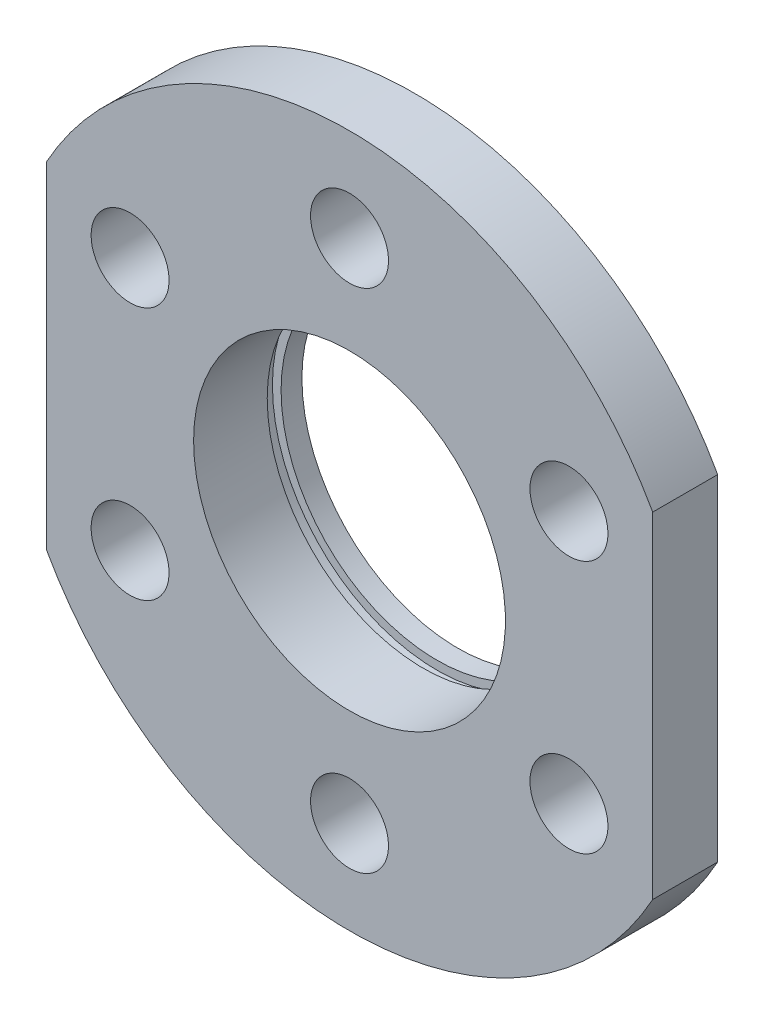
ISO-10303-21;
HEADER;
FILE_DESCRIPTION(('STEP AP214'),'2;1');
FILE_NAME('part.step','',(''),(''),'','','');
FILE_SCHEMA(('AUTOMOTIVE_DESIGN { 1 0 10303 214 1 1 1 1 }'));
ENDSEC;
DATA;
#1=APPLICATION_CONTEXT('core data for automotive mechanical design processes');
#2=APPLICATION_PROTOCOL_DEFINITION('international standard','automotive_design',2000,#1);
#3=PRODUCT_CONTEXT('',#1,'mechanical');
#4=PRODUCT('Part','Part','',(#3));
#5=PRODUCT_RELATED_PRODUCT_CATEGORY('part','',(#4));
#6=PRODUCT_DEFINITION_FORMATION('','',#4);
#7=PRODUCT_DEFINITION_CONTEXT('part definition',#1,'design');
#8=PRODUCT_DEFINITION('design','',#6,#7);
#9=PRODUCT_DEFINITION_SHAPE('','',#8);
#10=(LENGTH_UNIT() NAMED_UNIT(*) SI_UNIT(.MILLI.,.METRE.));
#11=(NAMED_UNIT(*) PLANE_ANGLE_UNIT() SI_UNIT($,.RADIAN.));
#12=(NAMED_UNIT(*) SI_UNIT($,.STERADIAN.) SOLID_ANGLE_UNIT());
#13=UNCERTAINTY_MEASURE_WITH_UNIT(LENGTH_MEASURE(1.E-05),#10,'distance_accuracy_value','');
#14=(GEOMETRIC_REPRESENTATION_CONTEXT(3) GLOBAL_UNCERTAINTY_ASSIGNED_CONTEXT((#13)) GLOBAL_UNIT_ASSIGNED_CONTEXT((#10,
#11,#12)) REPRESENTATION_CONTEXT('',''));
#15=CARTESIAN_POINT('',(0.,0.,0.));
#16=DIRECTION('',(0.,0.,1.));
#17=DIRECTION('',(1.,0.,0.));
#18=AXIS2_PLACEMENT_3D('',#15,#16,#17);
#19=CARTESIAN_POINT('',(0.,-1.02140518265514E-11,-13.6275138477817));
#20=DIRECTION('',(0.,0.,-1.));
#21=DIRECTION('',(-1.00000000000004,0.,0.));
#22=AXIS2_PLACEMENT_3D('',#19,#20,#21);
#23=CYLINDRICAL_SURFACE('',#22,40.);
#24=DIRECTION('',(0.,0.,-1.));
#25=VECTOR('',#24,1.);
#26=CARTESIAN_POINT('',(34.9999999999999,19.364916731027,-13.6275138478035));
#27=LINE('',#26,#25);
#28=CARTESIAN_POINT('',(35.,19.3649167310268,-7.5000000000216));
#29=VERTEX_POINT('',#28);
#30=CARTESIAN_POINT('',(35.,19.3649167310268,-2.17603712826531E-11));
#31=VERTEX_POINT('',#30);
#32=EDGE_CURVE('E12',#29,#31,#27,.F.);
#33=ORIENTED_EDGE('',*,*,#32,.F.);
#34=CARTESIAN_POINT('',(0.,-1.02140518265514E-11,-7.50000000000028));
#35=DIRECTION('',(0.,0.,-1.));
#36=DIRECTION('',(-1.00000000000004,0.,0.));
#37=AXIS2_PLACEMENT_3D('',#34,#35,#36);
#38=CIRCLE('',#37,40.);
#39=CARTESIAN_POINT('',(-35.0000000000051,19.364916731027,-7.50000000000028));
#40=VERTEX_POINT('',#39);
#41=EDGE_CURVE('E163',#40,#29,#38,.T.);
#42=ORIENTED_EDGE('',*,*,#41,.F.);
#43=DIRECTION('',(0.,0.,-1.));
#44=VECTOR('',#43,1.);
#45=CARTESIAN_POINT('',(-35.0000000000051,19.364916731027,-13.6275138477822));
#46=LINE('',#45,#44);
#47=CARTESIAN_POINT('',(-35.0000000000051,19.364916731027,0.));
#48=VERTEX_POINT('',#47);
#49=EDGE_CURVE('E160',#48,#40,#46,.T.);
#50=ORIENTED_EDGE('',*,*,#49,.F.);
#51=CARTESIAN_POINT('',(0.,-1.02140518265514E-11,0.));
#52=DIRECTION('',(0.,0.,-1.));
#53=DIRECTION('',(-1.00000000000004,0.,0.));
#54=AXIS2_PLACEMENT_3D('',#51,#52,#53);
#55=CIRCLE('',#54,40.);
#56=EDGE_CURVE('E157',#48,#31,#55,.T.);
#57=ORIENTED_EDGE('',*,*,#56,.T.);
#58=EDGE_LOOP('',(#33,#42,#50,#57));
#59=FACE_BOUND('',#58,.T.);
#60=ADVANCED_FACE('F106',(#59),#23,.T.);
#61=CARTESIAN_POINT('',(1.0547118733939E-11,39.9999999999898,0.));
#62=DIRECTION('',(0.,0.,1.));
#63=DIRECTION('',(1.00000000000004,0.,0.));
#64=AXIS2_PLACEMENT_3D('',#61,#62,#63);
#65=PLANE('',#64);
#66=DIRECTION('',(0.,-1.00000000000004,0.));
#67=VECTOR('',#66,1.);
#68=CARTESIAN_POINT('',(35.,19.3649167310268,-2.17603712826531E-11));
#69=LINE('',#68,#67);
#70=CARTESIAN_POINT('',(35.,-19.3649167310475,-2.17603712826531E-11));
#71=VERTEX_POINT('',#70);
#72=EDGE_CURVE('E120',#31,#71,#69,.T.);
#73=ORIENTED_EDGE('',*,*,#72,.F.);
#74=ORIENTED_EDGE('',*,*,#56,.F.);
#75=DIRECTION('',(0.,1.00000000000004,0.));
#76=VECTOR('',#75,1.);
#77=CARTESIAN_POINT('',(-35.0000000000051,19.364916731027,0.));
#78=LINE('',#77,#76);
#79=CARTESIAN_POINT('',(-35.0000000000051,-19.3649167310472,0.));
#80=VERTEX_POINT('',#79);
#81=EDGE_CURVE('E128',#80,#48,#78,.T.);
#82=ORIENTED_EDGE('',*,*,#81,.F.);
#83=EDGE_CURVE('E158',#71,#80,#55,.T.);
#84=ORIENTED_EDGE('',*,*,#83,.F.);
#85=EDGE_LOOP('',(#73,#74,#82,#84));
#86=FACE_BOUND('',#85,.T.);
#87=CARTESIAN_POINT('',(-25.3312430606998,14.625,0.));
#88=DIRECTION('',(0.,0.,-1.));
#89=DIRECTION('',(-1.00000000000004,0.,0.));
#90=AXIS2_PLACEMENT_3D('',#87,#88,#89);
#91=CIRCLE('',#90,4.5);
#92=CARTESIAN_POINT('',(-29.8312430607,14.625,0.));
#93=VERTEX_POINT('',#92);
#94=EDGE_CURVE('E216',#93,#93,#91,.T.);
#95=ORIENTED_EDGE('',*,*,#94,.T.);
#96=EDGE_LOOP('',(#95));
#97=FACE_BOUND('',#96,.T.);
#98=CARTESIAN_POINT('',(-25.331243060695,-14.625,0.));
#99=DIRECTION('',(0.,0.,-1.));
#100=DIRECTION('',(-1.00000000000004,0.,0.));
#101=AXIS2_PLACEMENT_3D('',#98,#99,#100);
#102=CIRCLE('',#101,4.5);
#103=CARTESIAN_POINT('',(-29.8312430606952,-14.625,0.));
#104=VERTEX_POINT('',#103);
#105=EDGE_CURVE('E222',#104,#104,#102,.T.);
#106=ORIENTED_EDGE('',*,*,#105,.T.);
#107=EDGE_LOOP('',(#106));
#108=FACE_BOUND('',#107,.T.);
#109=CARTESIAN_POINT('',(1.0325074129014E-11,-29.2500000000102,0.));
#110=DIRECTION('',(0.,0.,-1.));
#111=DIRECTION('',(-1.00000000000004,0.,0.));
#112=AXIS2_PLACEMENT_3D('',#109,#110,#111);
#113=CIRCLE('',#112,4.5);
#114=CARTESIAN_POINT('',(-4.49999999998986,-29.2500000000102,0.));
#115=VERTEX_POINT('',#114);
#116=EDGE_CURVE('E228',#115,#115,#113,.T.);
#117=ORIENTED_EDGE('',*,*,#116,.T.);
#118=EDGE_LOOP('',(#117));
#119=FACE_BOUND('',#118,.T.);
#120=CARTESIAN_POINT('',(25.3312430606999,-14.6250000000001,-2.17603712826531E-11));
#121=DIRECTION('',(0.,0.,-1.));
#122=DIRECTION('',(-1.00000000000004,0.,0.));
#123=AXIS2_PLACEMENT_3D('',#120,#121,#122);
#124=CIRCLE('',#123,4.5);
#125=CARTESIAN_POINT('',(20.8312430606997,-14.6250000000001,-2.1758945398088E-11));
#126=VERTEX_POINT('',#125);
#127=EDGE_CURVE('E234',#126,#126,#124,.T.);
#128=ORIENTED_EDGE('',*,*,#127,.T.);
#129=EDGE_LOOP('',(#128));
#130=FACE_BOUND('',#129,.T.);
#131=CARTESIAN_POINT('',(25.3312430606949,14.6249999999999,-2.17603712826531E-11));
#132=DIRECTION('',(0.,0.,-1.));
#133=DIRECTION('',(-1.00000000000004,0.,0.));
#134=AXIS2_PLACEMENT_3D('',#131,#132,#133);
#135=CIRCLE('',#134,4.5);
#136=CARTESIAN_POINT('',(20.8312430606947,14.6249999999999,-2.1758945398088E-11));
#137=VERTEX_POINT('',#136);
#138=EDGE_CURVE('E240',#137,#137,#135,.T.);
#139=ORIENTED_EDGE('',*,*,#138,.T.);
#140=EDGE_LOOP('',(#139));
#141=FACE_BOUND('',#140,.T.);
#142=CARTESIAN_POINT('',(0.,29.2499999999898,0.));
#143=DIRECTION('',(0.,0.,-1.));
#144=DIRECTION('',(-1.00000000000004,0.,0.));
#145=AXIS2_PLACEMENT_3D('',#142,#143,#144);
#146=CIRCLE('',#145,4.5);
#147=CARTESIAN_POINT('',(-4.50000000000019,29.2499999999898,0.));
#148=VERTEX_POINT('',#147);
#149=EDGE_CURVE('E165',#148,#148,#146,.T.);
#150=ORIENTED_EDGE('',*,*,#149,.T.);
#151=EDGE_LOOP('',(#150));
#152=FACE_BOUND('',#151,.T.);
#153=CARTESIAN_POINT('',(0.,-1.02140518265514E-11,0.));
#154=DIRECTION('',(0.,0.,-1.));
#155=DIRECTION('',(-1.00000000000004,0.,0.));
#156=AXIS2_PLACEMENT_3D('',#153,#154,#155);
#157=CIRCLE('',#156,18.);
#158=CARTESIAN_POINT('',(-18.0000000000008,-1.02874930796304E-11,0.));
#159=VERTEX_POINT('',#158);
#160=EDGE_CURVE('E187',#159,#159,#157,.T.);
#161=ORIENTED_EDGE('',*,*,#160,.T.);
#162=EDGE_LOOP('',(#161));
#163=FACE_BOUND('',#162,.T.);
#164=ADVANCED_FACE('F155',(#86,#97,#108,#119,#130,#141,#152,#163),#65,.T.);
#165=CARTESIAN_POINT('',(0.,-1.02140518265514E-11,-13.6275138477817));
#166=DIRECTION('',(0.,0.,-1.));
#167=DIRECTION('',(-1.00000000000004,0.,0.));
#168=AXIS2_PLACEMENT_3D('',#165,#166,#167);
#169=CYLINDRICAL_SURFACE('',#168,18.);
#170=CARTESIAN_POINT('',(0.,-1.02140518265514E-11,-8.49999999999973));
#171=DIRECTION('',(0.,0.,-1.));
#172=DIRECTION('',(-1.00000000000004,0.,0.));
#173=AXIS2_PLACEMENT_3D('',#170,#171,#172);
#174=CIRCLE('',#173,18.);
#175=CARTESIAN_POINT('',(-18.0000000000008,-1.02874930796304E-11,-8.49999999999972));
#176=VERTEX_POINT('',#175);
#177=EDGE_CURVE('E184',#176,#176,#174,.T.);
#178=ORIENTED_EDGE('',*,*,#177,.T.);
#179=EDGE_LOOP('',(#178));
#180=FACE_BOUND('',#179,.T.);
#181=ORIENTED_EDGE('',*,*,#160,.F.);
#182=EDGE_LOOP('',(#181));
#183=FACE_BOUND('',#182,.T.);
#184=ADVANCED_FACE('F267',(#180,#183),#169,.F.);
#185=CARTESIAN_POINT('',(0.,17.9999999999898,-8.49999999999973));
#186=DIRECTION('',(0.,0.,-1.));
#187=DIRECTION('',(-1.00000000000004,0.,0.));
#188=AXIS2_PLACEMENT_3D('',#185,#186,#187);
#189=PLANE('',#188);
#190=CARTESIAN_POINT('',(0.,-1.02140518265514E-11,-8.49999999999973));
#191=DIRECTION('',(0.,0.,-1.));
#192=DIRECTION('',(-1.00000000000004,0.,0.));
#193=AXIS2_PLACEMENT_3D('',#190,#191,#192);
#194=CIRCLE('',#193,19.);
#195=CARTESIAN_POINT('',(-19.0000000000008,-1.02915731492459E-11,-8.49999999999972));
#196=VERTEX_POINT('',#195);
#197=EDGE_CURVE('E181',#196,#196,#194,.T.);
#198=ORIENTED_EDGE('',*,*,#197,.T.);
#199=EDGE_LOOP('',(#198));
#200=FACE_BOUND('',#199,.T.);
#201=ORIENTED_EDGE('',*,*,#177,.F.);
#202=EDGE_LOOP('',(#201));
#203=FACE_BOUND('',#202,.T.);
#204=ADVANCED_FACE('F290',(#200,#203),#189,.T.);
#205=CARTESIAN_POINT('',(0.,-1.02140518265514E-11,-13.6275138477817));
#206=DIRECTION('',(0.,0.,-1.));
#207=DIRECTION('',(-1.00000000000004,0.,0.));
#208=AXIS2_PLACEMENT_3D('',#205,#206,#207);
#209=CYLINDRICAL_SURFACE('',#208,19.);
#210=CARTESIAN_POINT('',(0.,-1.02140518265514E-11,-10.1));
#211=DIRECTION('',(0.,0.,-1.));
#212=DIRECTION('',(-1.00000000000004,0.,0.));
#213=AXIS2_PLACEMENT_3D('',#210,#211,#212);
#214=CIRCLE('',#213,19.);
#215=CARTESIAN_POINT('',(-19.0000000000008,-1.02915731492459E-11,-10.1));
#216=VERTEX_POINT('',#215);
#217=EDGE_CURVE('E178',#216,#216,#214,.T.);
#218=ORIENTED_EDGE('',*,*,#217,.T.);
#219=EDGE_LOOP('',(#218));
#220=FACE_BOUND('',#219,.T.);
#221=ORIENTED_EDGE('',*,*,#197,.F.);
#222=EDGE_LOOP('',(#221));
#223=FACE_BOUND('',#222,.T.);
#224=ADVANCED_FACE('F286',(#220,#223),#209,.F.);
#225=CARTESIAN_POINT('',(0.,18.9999999999897,-10.1));
#226=DIRECTION('',(0.,0.,1.));
#227=DIRECTION('',(1.00000000000004,0.,0.));
#228=AXIS2_PLACEMENT_3D('',#225,#226,#227);
#229=PLANE('',#228);
#230=CARTESIAN_POINT('',(0.,-1.02140518265514E-11,-10.1));
#231=DIRECTION('',(0.,0.,-1.));
#232=DIRECTION('',(-1.00000000000004,0.,0.));
#233=AXIS2_PLACEMENT_3D('',#230,#231,#232);
#234=CIRCLE('',#233,18.);
#235=CARTESIAN_POINT('',(-18.0000000000008,-1.02874930796304E-11,-10.1));
#236=VERTEX_POINT('',#235);
#237=EDGE_CURVE('E175',#236,#236,#234,.T.);
#238=ORIENTED_EDGE('',*,*,#237,.T.);
#239=EDGE_LOOP('',(#238));
#240=FACE_BOUND('',#239,.T.);
#241=ORIENTED_EDGE('',*,*,#217,.F.);
#242=EDGE_LOOP('',(#241));
#243=FACE_BOUND('',#242,.T.);
#244=ADVANCED_FACE('F282',(#240,#243),#229,.T.);
#245=CARTESIAN_POINT('',(0.,-1.02140518265514E-11,-13.6275138477817));
#246=DIRECTION('',(0.,0.,-1.));
#247=DIRECTION('',(-1.00000000000004,0.,0.));
#248=AXIS2_PLACEMENT_3D('',#245,#246,#247);
#249=CYLINDRICAL_SURFACE('',#248,18.);
#250=CARTESIAN_POINT('',(0.,-1.02140518265514E-11,-12.5038000000002));
#251=DIRECTION('',(0.,0.,-1.));
#252=DIRECTION('',(-1.00000000000004,0.,0.));
#253=AXIS2_PLACEMENT_3D('',#250,#251,#252);
#254=CIRCLE('',#253,18.);
#255=CARTESIAN_POINT('',(-18.0000000000008,-1.02874930796304E-11,-12.5038000000002));
#256=VERTEX_POINT('',#255);
#257=EDGE_CURVE('E172',#256,#256,#254,.T.);
#258=ORIENTED_EDGE('',*,*,#257,.T.);
#259=EDGE_LOOP('',(#258));
#260=FACE_BOUND('',#259,.T.);
#261=ORIENTED_EDGE('',*,*,#237,.F.);
#262=EDGE_LOOP('',(#261));
#263=FACE_BOUND('',#262,.T.);
#264=ADVANCED_FACE('F278',(#260,#263),#249,.F.);
#265=CARTESIAN_POINT('',(0.,17.9999999999898,-12.5038000000002));
#266=DIRECTION('',(0.,0.,-1.));
#267=DIRECTION('',(-1.00000000000004,0.,0.));
#268=AXIS2_PLACEMENT_3D('',#265,#266,#267);
#269=PLANE('',#268);
#270=CARTESIAN_POINT('',(0.,-1.02140518265514E-11,-12.5038000000002));
#271=DIRECTION('',(0.,0.,-1.));
#272=DIRECTION('',(-1.00000000000004,0.,0.));
#273=AXIS2_PLACEMENT_3D('',#270,#271,#272);
#274=CIRCLE('',#273,22.5);
#275=CARTESIAN_POINT('',(-22.5000000000009,-1.03058533929001E-11,-12.5038000000002));
#276=VERTEX_POINT('',#275);
#277=EDGE_CURVE('E190',#276,#276,#274,.T.);
#278=ORIENTED_EDGE('',*,*,#277,.T.);
#279=EDGE_LOOP('',(#278));
#280=FACE_BOUND('',#279,.T.);
#281=ORIENTED_EDGE('',*,*,#257,.F.);
#282=EDGE_LOOP('',(#281));
#283=FACE_BOUND('',#282,.T.);
#284=ADVANCED_FACE('F274',(#280,#283),#269,.T.);
#285=CARTESIAN_POINT('',(0.,-1.02140518265514E-11,-13.6275138477817));
#286=DIRECTION('',(0.,0.,-1.));
#287=DIRECTION('',(-1.00000000000004,0.,0.));
#288=AXIS2_PLACEMENT_3D('',#285,#286,#287);
#289=CYLINDRICAL_SURFACE('',#288,23.5);
#290=CARTESIAN_POINT('',(0.,-1.02140518265514E-11,-11.5037999999998));
#291=DIRECTION('',(0.,0.,-1.));
#292=DIRECTION('',(-1.00000000000004,0.,0.));
#293=AXIS2_PLACEMENT_3D('',#290,#291,#292);
#294=CIRCLE('',#293,23.5);
#295=CARTESIAN_POINT('',(-23.500000000001,-1.03099334625156E-11,-11.5037999999998));
#296=VERTEX_POINT('',#295);
#297=EDGE_CURVE('E193',#296,#296,#294,.F.);
#298=ORIENTED_EDGE('',*,*,#297,.T.);
#299=EDGE_LOOP('',(#298));
#300=FACE_BOUND('',#299,.T.);
#301=CARTESIAN_POINT('',(0.,-1.02140518265514E-11,-7.50000000000028));
#302=DIRECTION('',(0.,0.,-1.));
#303=DIRECTION('',(-1.00000000000004,0.,0.));
#304=AXIS2_PLACEMENT_3D('',#301,#302,#303);
#305=CIRCLE('',#304,23.5);
#306=CARTESIAN_POINT('',(-23.500000000001,-1.03099334625156E-11,-7.50000000000028));
#307=VERTEX_POINT('',#306);
#308=EDGE_CURVE('E169',#307,#307,#305,.T.);
#309=ORIENTED_EDGE('',*,*,#308,.T.);
#310=EDGE_LOOP('',(#309));
#311=FACE_BOUND('',#310,.T.);
#312=ADVANCED_FACE('F271',(#300,#311),#289,.T.);
#313=CARTESIAN_POINT('',(1.0547118733939E-11,23.4999999999899,-7.50000000000028));
#314=DIRECTION('',(0.,0.,-1.));
#315=DIRECTION('',(-1.00000000000004,0.,0.));
#316=AXIS2_PLACEMENT_3D('',#313,#314,#315);
#317=PLANE('',#316);
#318=DIRECTION('',(0.,1.00000000000004,0.));
#319=VECTOR('',#318,1.);
#320=CARTESIAN_POINT('',(35.0000000000105,23.4999999999899,-7.5000000000216));
#321=LINE('',#320,#319);
#322=CARTESIAN_POINT('',(35.,-19.3649167310475,-7.5000000000216));
#323=VERTEX_POINT('',#322);
#324=EDGE_CURVE('E147',#323,#29,#321,.T.);
#325=ORIENTED_EDGE('',*,*,#324,.F.);
#326=CARTESIAN_POINT('',(-35.0000000000051,-19.3649167310472,-7.50000000000028));
#327=VERTEX_POINT('',#326);
#328=EDGE_CURVE('E161',#323,#327,#38,.T.);
#329=ORIENTED_EDGE('',*,*,#328,.T.);
#330=DIRECTION('',(0.,-1.00000000000004,0.));
#331=VECTOR('',#330,1.);
#332=CARTESIAN_POINT('',(-34.9999999999946,23.4999999999899,-7.50000000000028));
#333=LINE('',#332,#331);
#334=EDGE_CURVE('E209',#40,#327,#333,.T.);
#335=ORIENTED_EDGE('',*,*,#334,.F.);
#336=ORIENTED_EDGE('',*,*,#41,.T.);
#337=EDGE_LOOP('',(#325,#329,#335,#336));
#338=FACE_BOUND('',#337,.T.);
#339=CARTESIAN_POINT('',(-25.3312430606998,14.625,-7.50000000000028));
#340=DIRECTION('',(0.,0.,-1.));
#341=DIRECTION('',(-1.00000000000004,0.,0.));
#342=AXIS2_PLACEMENT_3D('',#339,#340,#341);
#343=CIRCLE('',#342,4.5);
#344=CARTESIAN_POINT('',(-29.8312430607,14.625,-7.50000000000028));
#345=VERTEX_POINT('',#344);
#346=EDGE_CURVE('E211',#345,#345,#343,.T.);
#347=ORIENTED_EDGE('',*,*,#346,.F.);
#348=EDGE_LOOP('',(#347));
#349=FACE_BOUND('',#348,.T.);
#350=CARTESIAN_POINT('',(-25.331243060695,-14.625,-7.50000000000028));
#351=DIRECTION('',(0.,0.,-1.));
#352=DIRECTION('',(-1.00000000000004,0.,0.));
#353=AXIS2_PLACEMENT_3D('',#350,#351,#352);
#354=CIRCLE('',#353,4.5);
#355=CARTESIAN_POINT('',(-29.8312430606952,-14.625,-7.50000000000028));
#356=VERTEX_POINT('',#355);
#357=EDGE_CURVE('E219',#356,#356,#354,.T.);
#358=ORIENTED_EDGE('',*,*,#357,.F.);
#359=EDGE_LOOP('',(#358));
#360=FACE_BOUND('',#359,.T.);
#361=CARTESIAN_POINT('',(1.0325074129014E-11,-29.2500000000102,-7.49999999999984));
#362=DIRECTION('',(0.,0.,-1.));
#363=DIRECTION('',(-1.00000000000004,0.,0.));
#364=AXIS2_PLACEMENT_3D('',#361,#362,#363);
#365=CIRCLE('',#364,4.5);
#366=CARTESIAN_POINT('',(-4.49999999998986,-29.2500000000102,-7.49999999999984));
#367=VERTEX_POINT('',#366);
#368=EDGE_CURVE('E225',#367,#367,#365,.T.);
#369=ORIENTED_EDGE('',*,*,#368,.F.);
#370=EDGE_LOOP('',(#369));
#371=FACE_BOUND('',#370,.T.);
#372=CARTESIAN_POINT('',(25.3312430606999,-14.6250000000001,-7.5000000000216));
#373=DIRECTION('',(0.,0.,-1.));
#374=DIRECTION('',(-1.00000000000004,0.,0.));
#375=AXIS2_PLACEMENT_3D('',#372,#373,#374);
#376=CIRCLE('',#375,4.5);
#377=CARTESIAN_POINT('',(20.8312430606997,-14.6250000000001,-7.5000000000216));
#378=VERTEX_POINT('',#377);
#379=EDGE_CURVE('E231',#378,#378,#376,.T.);
#380=ORIENTED_EDGE('',*,*,#379,.F.);
#381=EDGE_LOOP('',(#380));
#382=FACE_BOUND('',#381,.T.);
#383=CARTESIAN_POINT('',(25.3312430606949,14.6249999999999,-7.5000000000216));
#384=DIRECTION('',(0.,0.,-1.));
#385=DIRECTION('',(-1.00000000000004,0.,0.));
#386=AXIS2_PLACEMENT_3D('',#383,#384,#385);
#387=CIRCLE('',#386,4.5);
#388=CARTESIAN_POINT('',(20.8312430606947,14.6249999999999,-7.5000000000216));
#389=VERTEX_POINT('',#388);
#390=EDGE_CURVE('E237',#389,#389,#387,.T.);
#391=ORIENTED_EDGE('',*,*,#390,.F.);
#392=EDGE_LOOP('',(#391));
#393=FACE_BOUND('',#392,.T.);
#394=CARTESIAN_POINT('',(0.,29.2499999999898,-7.50000000000028));
#395=DIRECTION('',(0.,0.,-1.));
#396=DIRECTION('',(-1.00000000000004,0.,0.));
#397=AXIS2_PLACEMENT_3D('',#394,#395,#396);
#398=CIRCLE('',#397,4.5);
#399=CARTESIAN_POINT('',(-4.50000000000019,29.2499999999898,-7.50000000000028));
#400=VERTEX_POINT('',#399);
#401=EDGE_CURVE('E242',#400,#400,#398,.T.);
#402=ORIENTED_EDGE('',*,*,#401,.F.);
#403=EDGE_LOOP('',(#402));
#404=FACE_BOUND('',#403,.T.);
#405=ORIENTED_EDGE('',*,*,#308,.F.);
#406=EDGE_LOOP('',(#405));
#407=FACE_BOUND('',#406,.T.);
#408=ADVANCED_FACE('F201',(#338,#349,#360,#371,#382,#393,#404,#407),#317,.T.);
#409=DIRECTION('',(0.,0.,-1.));
#410=VECTOR('',#409,1.);
#411=CARTESIAN_POINT('',(35.,-19.3649167310475,-13.6275138478035));
#412=LINE('',#411,#410);
#413=EDGE_CURVE('E114',#71,#323,#412,.T.);
#414=ORIENTED_EDGE('',*,*,#413,.F.);
#415=ORIENTED_EDGE('',*,*,#83,.T.);
#416=DIRECTION('',(0.,0.,-1.));
#417=VECTOR('',#416,1.);
#418=CARTESIAN_POINT('',(-35.0000000000051,-19.3649167310475,-13.6275138477822));
#419=LINE('',#418,#417);
#420=EDGE_CURVE('E197',#327,#80,#419,.F.);
#421=ORIENTED_EDGE('',*,*,#420,.F.);
#422=ORIENTED_EDGE('',*,*,#328,.F.);
#423=EDGE_LOOP('',(#414,#415,#421,#422));
#424=FACE_BOUND('',#423,.T.);
#425=ADVANCED_FACE('F207',(#424),#23,.T.);
#426=CARTESIAN_POINT('',(0.,29.2499999999898,-7.50000000000028));
#427=DIRECTION('',(0.,0.,-1.));
#428=DIRECTION('',(-1.00000000000004,0.,0.));
#429=AXIS2_PLACEMENT_3D('',#426,#427,#428);
#430=CYLINDRICAL_SURFACE('',#429,4.5);
#431=ORIENTED_EDGE('',*,*,#149,.F.);
#432=EDGE_LOOP('',(#431));
#433=FACE_BOUND('',#432,.T.);
#434=ORIENTED_EDGE('',*,*,#401,.T.);
#435=EDGE_LOOP('',(#434));
#436=FACE_BOUND('',#435,.T.);
#437=ADVANCED_FACE('F251',(#433,#436),#430,.F.);
#438=CARTESIAN_POINT('',(25.3312430606949,14.6249999999999,-7.5000000000216));
#439=DIRECTION('',(0.,0.,-1.));
#440=DIRECTION('',(-1.00000000000004,0.,0.));
#441=AXIS2_PLACEMENT_3D('',#438,#439,#440);
#442=CYLINDRICAL_SURFACE('',#441,4.5);
#443=ORIENTED_EDGE('',*,*,#138,.F.);
#444=EDGE_LOOP('',(#443));
#445=FACE_BOUND('',#444,.T.);
#446=ORIENTED_EDGE('',*,*,#390,.T.);
#447=EDGE_LOOP('',(#446));
#448=FACE_BOUND('',#447,.T.);
#449=ADVANCED_FACE('F253',(#445,#448),#442,.F.);
#450=CARTESIAN_POINT('',(25.3312430606999,-14.6250000000001,-7.5000000000216));
#451=DIRECTION('',(0.,0.,-1.));
#452=DIRECTION('',(-1.00000000000004,0.,0.));
#453=AXIS2_PLACEMENT_3D('',#450,#451,#452);
#454=CYLINDRICAL_SURFACE('',#453,4.5);
#455=ORIENTED_EDGE('',*,*,#127,.F.);
#456=EDGE_LOOP('',(#455));
#457=FACE_BOUND('',#456,.T.);
#458=ORIENTED_EDGE('',*,*,#379,.T.);
#459=EDGE_LOOP('',(#458));
#460=FACE_BOUND('',#459,.T.);
#461=ADVANCED_FACE('F259',(#457,#460),#454,.F.);
#462=CARTESIAN_POINT('',(1.0325074129014E-11,-29.2500000000102,-7.49999999999984));
#463=DIRECTION('',(0.,0.,-1.));
#464=DIRECTION('',(-1.00000000000004,0.,0.));
#465=AXIS2_PLACEMENT_3D('',#462,#463,#464);
#466=CYLINDRICAL_SURFACE('',#465,4.5);
#467=ORIENTED_EDGE('',*,*,#116,.F.);
#468=EDGE_LOOP('',(#467));
#469=FACE_BOUND('',#468,.T.);
#470=ORIENTED_EDGE('',*,*,#368,.T.);
#471=EDGE_LOOP('',(#470));
#472=FACE_BOUND('',#471,.T.);
#473=ADVANCED_FACE('F357',(#469,#472),#466,.F.);
#474=CARTESIAN_POINT('',(-25.331243060695,-14.625,-7.50000000000028));
#475=DIRECTION('',(0.,0.,-1.));
#476=DIRECTION('',(-1.00000000000004,0.,0.));
#477=AXIS2_PLACEMENT_3D('',#474,#475,#476);
#478=CYLINDRICAL_SURFACE('',#477,4.5);
#479=ORIENTED_EDGE('',*,*,#105,.F.);
#480=EDGE_LOOP('',(#479));
#481=FACE_BOUND('',#480,.T.);
#482=ORIENTED_EDGE('',*,*,#357,.T.);
#483=EDGE_LOOP('',(#482));
#484=FACE_BOUND('',#483,.T.);
#485=ADVANCED_FACE('F367',(#481,#484),#478,.F.);
#486=CARTESIAN_POINT('',(-25.3312430606998,14.625,-7.50000000000028));
#487=DIRECTION('',(0.,0.,-1.));
#488=DIRECTION('',(-1.00000000000004,0.,0.));
#489=AXIS2_PLACEMENT_3D('',#486,#487,#488);
#490=CYLINDRICAL_SURFACE('',#489,4.5);
#491=ORIENTED_EDGE('',*,*,#94,.F.);
#492=EDGE_LOOP('',(#491));
#493=FACE_BOUND('',#492,.T.);
#494=ORIENTED_EDGE('',*,*,#346,.T.);
#495=EDGE_LOOP('',(#494));
#496=FACE_BOUND('',#495,.T.);
#497=ADVANCED_FACE('F377',(#493,#496),#490,.F.);
#498=CARTESIAN_POINT('',(0.,-1.02140518265514E-11,-12.5038000000002));
#499=DIRECTION('',(0.,0.,1.));
#500=DIRECTION('',(1.00000000000004,0.,0.));
#501=AXIS2_PLACEMENT_3D('',#498,#499,#500);
#502=CONICAL_SURFACE('',#501,22.5,0.785398163397445);
#503=ORIENTED_EDGE('',*,*,#297,.F.);
#504=EDGE_LOOP('',(#503));
#505=FACE_BOUND('',#504,.T.);
#506=ORIENTED_EDGE('',*,*,#277,.F.);
#507=EDGE_LOOP('',(#506));
#508=FACE_BOUND('',#507,.T.);
#509=ADVANCED_FACE('F108',(#505,#508),#502,.T.);
#510=CARTESIAN_POINT('',(-35.0000000000051,19.364916731027,-12.5038000000002));
#511=DIRECTION('',(1.00000000000004,0.,0.));
#512=DIRECTION('',(0.,0.,-1.));
#513=AXIS2_PLACEMENT_3D('',#510,#511,#512);
#514=PLANE('',#513);
#515=ORIENTED_EDGE('',*,*,#334,.T.);
#516=ORIENTED_EDGE('',*,*,#420,.T.);
#517=ORIENTED_EDGE('',*,*,#81,.T.);
#518=ORIENTED_EDGE('',*,*,#49,.T.);
#519=EDGE_LOOP('',(#515,#516,#517,#518));
#520=FACE_BOUND('',#519,.T.);
#521=ADVANCED_FACE('F208',(#520),#514,.F.);
#522=CARTESIAN_POINT('',(35.,19.3649167310268,-12.5038000000215));
#523=DIRECTION('',(-1.00000000000004,0.,0.));
#524=DIRECTION('',(0.,0.,1.));
#525=AXIS2_PLACEMENT_3D('',#522,#523,#524);
#526=PLANE('',#525);
#527=ORIENTED_EDGE('',*,*,#324,.T.);
#528=ORIENTED_EDGE('',*,*,#32,.T.);
#529=ORIENTED_EDGE('',*,*,#72,.T.);
#530=ORIENTED_EDGE('',*,*,#413,.T.);
#531=EDGE_LOOP('',(#527,#528,#529,#530));
#532=FACE_BOUND('',#531,.T.);
#533=ADVANCED_FACE('F145',(#532),#526,.F.);
#534=CLOSED_SHELL('',(#60,#164,#184,#204,#224,#244,#264,#284,#312,#408,#425,#437,#449,#461,#473,
#485,#497,#509,#521,#533));
#535=MANIFOLD_SOLID_BREP('B2',#534);
#536=ADVANCED_BREP_SHAPE_REPRESENTATION('',(#18,#535),#14);
#537=SHAPE_DEFINITION_REPRESENTATION(#9,#536);
ENDSEC;
END-ISO-10303-21;
